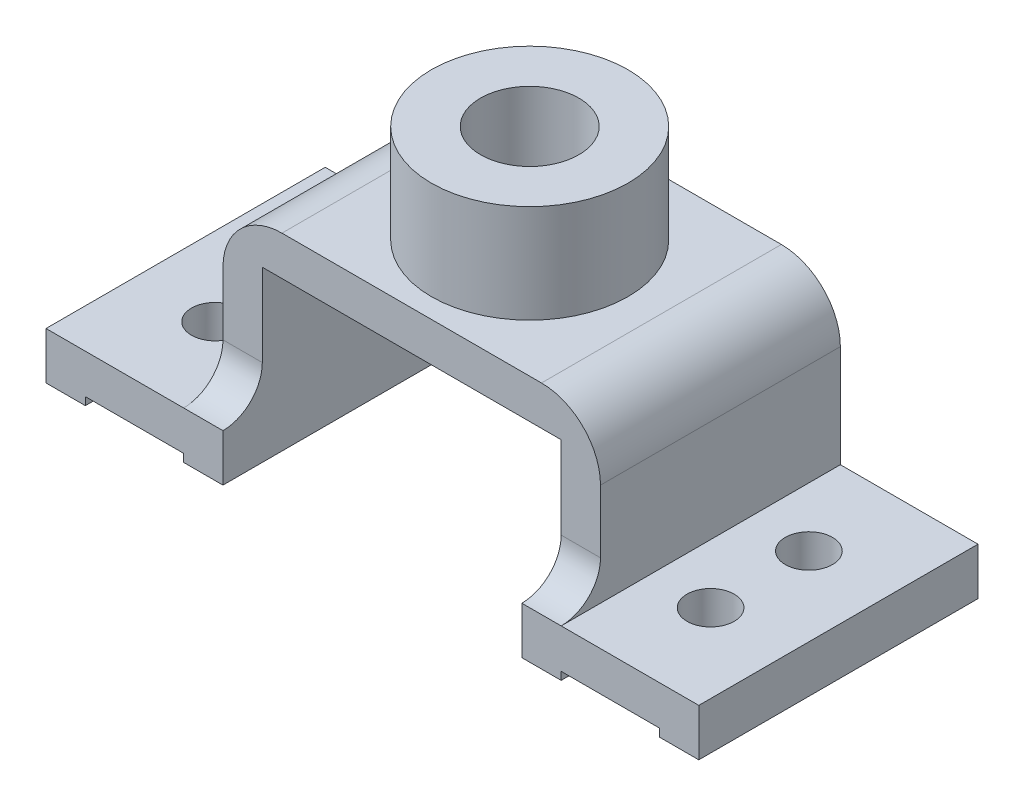
ISO-10303-21;
HEADER;
FILE_DESCRIPTION(('STEP AP214'),'2;1');
FILE_NAME('part.step','',(''),(''),'','','');
FILE_SCHEMA(('AUTOMOTIVE_DESIGN { 1 0 10303 214 1 1 1 1 }'));
ENDSEC;
DATA;
#1=APPLICATION_CONTEXT('core data for automotive mechanical design processes');
#2=APPLICATION_PROTOCOL_DEFINITION('international standard','automotive_design',2000,#1);
#3=PRODUCT_CONTEXT('',#1,'mechanical');
#4=PRODUCT('Part','Part','',(#3));
#5=PRODUCT_RELATED_PRODUCT_CATEGORY('part','',(#4));
#6=PRODUCT_DEFINITION_FORMATION('','',#4);
#7=PRODUCT_DEFINITION_CONTEXT('part definition',#1,'design');
#8=PRODUCT_DEFINITION('design','',#6,#7);
#9=PRODUCT_DEFINITION_SHAPE('','',#8);
#10=(LENGTH_UNIT() NAMED_UNIT(*) SI_UNIT(.MILLI.,.METRE.));
#11=(NAMED_UNIT(*) PLANE_ANGLE_UNIT() SI_UNIT($,.RADIAN.));
#12=(NAMED_UNIT(*) SI_UNIT($,.STERADIAN.) SOLID_ANGLE_UNIT());
#13=UNCERTAINTY_MEASURE_WITH_UNIT(LENGTH_MEASURE(1.E-05),#10,'distance_accuracy_value','');
#14=(GEOMETRIC_REPRESENTATION_CONTEXT(3) GLOBAL_UNCERTAINTY_ASSIGNED_CONTEXT((#13)) GLOBAL_UNIT_ASSIGNED_CONTEXT((#10,
#11,#12)) REPRESENTATION_CONTEXT('',''));
#15=CARTESIAN_POINT('',(0.,0.,0.));
#16=DIRECTION('',(0.,0.,1.));
#17=DIRECTION('',(1.,0.,0.));
#18=AXIS2_PLACEMENT_3D('',#15,#16,#17);
#19=CARTESIAN_POINT('',(-43.0476516234429,8.46441698999387,-71.));
#20=DIRECTION('',(-1.,0.,0.));
#21=DIRECTION('',(0.,0.,1.));
#22=AXIS2_PLACEMENT_3D('',#19,#20,#21);
#23=PLANE('',#22);
#24=DIRECTION('',(0.,-1.,0.));
#25=VECTOR('',#24,1.);
#26=CARTESIAN_POINT('',(-43.0476516234429,8.46441698999387,0.));
#27=LINE('',#26,#25);
#28=CARTESIAN_POINT('',(-43.0476516234429,8.46441698999387,0.));
#29=VERTEX_POINT('',#28);
#30=CARTESIAN_POINT('',(-43.0476516234429,-3.53558301000613,0.));
#31=VERTEX_POINT('',#30);
#32=EDGE_CURVE('E347',#29,#31,#27,.T.);
#33=ORIENTED_EDGE('',*,*,#32,.F.);
#34=DIRECTION('',(0.,0.,1.));
#35=VECTOR('',#34,1.);
#36=CARTESIAN_POINT('',(-43.0476516234429,8.46441698999387,-71.));
#37=LINE('',#36,#35);
#38=CARTESIAN_POINT('',(-43.0476516234429,8.46441698999387,-71.));
#39=VERTEX_POINT('',#38);
#40=EDGE_CURVE('E420',#39,#29,#37,.T.);
#41=ORIENTED_EDGE('',*,*,#40,.F.);
#42=DIRECTION('',(0.,-1.,0.));
#43=VECTOR('',#42,1.);
#44=CARTESIAN_POINT('',(-43.0476516234429,8.46441698999387,-71.));
#45=LINE('',#44,#43);
#46=CARTESIAN_POINT('',(-43.0476516234429,-3.53558301000613,-71.));
#47=VERTEX_POINT('',#46);
#48=EDGE_CURVE('E357',#39,#47,#45,.T.);
#49=ORIENTED_EDGE('',*,*,#48,.T.);
#50=DIRECTION('',(0.,0.,1.));
#51=VECTOR('',#50,1.);
#52=CARTESIAN_POINT('',(-43.0476516234429,-3.53558301000613,-71.));
#53=LINE('',#52,#51);
#54=EDGE_CURVE('E388',#47,#31,#53,.T.);
#55=ORIENTED_EDGE('',*,*,#54,.T.);
#56=EDGE_LOOP('',(#33,#41,#49,#55));
#57=FACE_BOUND('',#56,.T.);
#58=ADVANCED_FACE('F39',(#57),#23,.T.);
#59=CARTESIAN_POINT('',(1.95234837655708,8.46441698999388,-71.));
#60=DIRECTION('',(0.,1.,0.));
#61=DIRECTION('',(-1.,0.,0.));
#62=AXIS2_PLACEMENT_3D('',#59,#60,#61);
#63=PLANE('',#62);
#64=CARTESIAN_POINT('',(-23.0476516234429,8.46441698999388,-23.));
#65=DIRECTION('',(0.,1.,0.));
#66=DIRECTION('',(0.,0.,1.));
#67=AXIS2_PLACEMENT_3D('',#64,#65,#66);
#68=CIRCLE('',#67,5.99999999999999);
#69=CARTESIAN_POINT('',(-23.0476516234429,8.46441698999388,-17.));
#70=VERTEX_POINT('',#69);
#71=EDGE_CURVE('E900',#70,#70,#68,.T.);
#72=ORIENTED_EDGE('',*,*,#71,.F.);
#73=EDGE_LOOP('',(#72));
#74=FACE_BOUND('',#73,.T.);
#75=CARTESIAN_POINT('',(-23.0476516234429,8.46441698999388,-48.));
#76=DIRECTION('',(0.,1.,0.));
#77=DIRECTION('',(0.,0.,1.));
#78=AXIS2_PLACEMENT_3D('',#75,#76,#77);
#79=CIRCLE('',#78,5.99999999999999);
#80=CARTESIAN_POINT('',(-23.0476516234429,8.46441698999388,-42.));
#81=VERTEX_POINT('',#80);
#82=EDGE_CURVE('E844',#81,#81,#79,.T.);
#83=ORIENTED_EDGE('',*,*,#82,.F.);
#84=EDGE_LOOP('',(#83));
#85=FACE_BOUND('',#84,.T.);
#86=DIRECTION('',(-1.,0.,0.));
#87=VECTOR('',#86,1.);
#88=CARTESIAN_POINT('',(1.95234837655708,8.46441698999388,0.));
#89=LINE('',#88,#87);
#90=CARTESIAN_POINT('',(-8.04765162344291,8.46441698999388,0.));
#91=VERTEX_POINT('',#90);
#92=EDGE_CURVE('E416',#91,#29,#89,.T.);
#93=ORIENTED_EDGE('',*,*,#92,.F.);
#94=DIRECTION('',(0.,0.,1.));
#95=VECTOR('',#94,1.);
#96=CARTESIAN_POINT('',(-8.04765162344292,8.46441698999388,-71.));
#97=LINE('',#96,#95);
#98=CARTESIAN_POINT('',(-8.04765162344292,8.46441698999388,-71.));
#99=VERTEX_POINT('',#98);
#100=EDGE_CURVE('E344',#99,#91,#97,.T.);
#101=ORIENTED_EDGE('',*,*,#100,.F.);
#102=DIRECTION('',(-1.,0.,0.));
#103=VECTOR('',#102,1.);
#104=CARTESIAN_POINT('',(1.95234837655708,8.46441698999388,-71.));
#105=LINE('',#104,#103);
#106=EDGE_CURVE('E385',#99,#39,#105,.T.);
#107=ORIENTED_EDGE('',*,*,#106,.T.);
#108=ORIENTED_EDGE('',*,*,#40,.T.);
#109=EDGE_LOOP('',(#93,#101,#107,#108));
#110=FACE_BOUND('',#109,.T.);
#111=ADVANCED_FACE('F495',(#74,#85,#110),#63,.T.);
#112=CARTESIAN_POINT('',(1.95234837655708,-3.53558301000612,-71.));
#113=DIRECTION('',(1.,0.,0.));
#114=DIRECTION('',(0.,0.,-1.));
#115=AXIS2_PLACEMENT_3D('',#112,#113,#114);
#116=PLANE('',#115);
#117=DIRECTION('',(0.,1.,0.));
#118=VECTOR('',#117,1.);
#119=CARTESIAN_POINT('',(1.95234837655708,-3.53558301000612,0.));
#120=LINE('',#119,#118);
#121=CARTESIAN_POINT('',(1.95234837655708,-3.53558301000612,0.));
#122=VERTEX_POINT('',#121);
#123=CARTESIAN_POINT('',(1.95234837655708,8.46441698999388,0.));
#124=VERTEX_POINT('',#123);
#125=EDGE_CURVE('E412',#122,#124,#120,.T.);
#126=ORIENTED_EDGE('',*,*,#125,.F.);
#127=DIRECTION('',(0.,0.,1.));
#128=VECTOR('',#127,1.);
#129=CARTESIAN_POINT('',(1.95234837655708,-3.53558301000612,-71.));
#130=LINE('',#129,#128);
#131=CARTESIAN_POINT('',(1.95234837655708,-3.53558301000612,-71.));
#132=VERTEX_POINT('',#131);
#133=EDGE_CURVE('E425',#132,#122,#130,.T.);
#134=ORIENTED_EDGE('',*,*,#133,.F.);
#135=DIRECTION('',(0.,1.,0.));
#136=VECTOR('',#135,1.);
#137=CARTESIAN_POINT('',(1.95234837655708,-3.53558301000612,-71.));
#138=LINE('',#137,#136);
#139=CARTESIAN_POINT('',(1.95234837655708,39.4644169899939,-71.));
#140=VERTEX_POINT('',#139);
#141=EDGE_CURVE('E382',#132,#140,#138,.T.);
#142=ORIENTED_EDGE('',*,*,#141,.T.);
#143=DIRECTION('',(0.,0.,1.));
#144=VECTOR('',#143,1.);
#145=CARTESIAN_POINT('',(1.95234837655708,39.4644169899939,-71.));
#146=LINE('',#145,#144);
#147=CARTESIAN_POINT('',(1.95234837655708,39.4644169899939,-10.));
#148=VERTEX_POINT('',#147);
#149=EDGE_CURVE('E323',#140,#148,#146,.T.);
#150=ORIENTED_EDGE('',*,*,#149,.T.);
#151=DIRECTION('',(0.,1.,0.));
#152=VECTOR('',#151,1.);
#153=CARTESIAN_POINT('',(1.95234837655708,8.46441698999388,-10.));
#154=LINE('',#153,#152);
#155=CARTESIAN_POINT('',(1.95234837655708,18.4644169899939,-10.));
#156=VERTEX_POINT('',#155);
#157=EDGE_CURVE('E290',#156,#148,#154,.T.);
#158=ORIENTED_EDGE('',*,*,#157,.F.);
#159=CARTESIAN_POINT('',(1.95234837655708,18.4644169899939,0.));
#160=DIRECTION('',(1.,0.,0.));
#161=DIRECTION('',(0.,0.,-1.));
#162=AXIS2_PLACEMENT_3D('',#159,#160,#161);
#163=CIRCLE('',#162,10.);
#164=EDGE_CURVE('E456',#156,#124,#163,.F.);
#165=ORIENTED_EDGE('',*,*,#164,.T.);
#166=EDGE_LOOP('',(#126,#134,#142,#150,#158,#165));
#167=FACE_BOUND('',#166,.T.);
#168=ADVANCED_FACE('F522',(#167),#116,.T.);
#169=CARTESIAN_POINT('',(-8.04765162344292,-3.53558301000612,-71.));
#170=DIRECTION('',(0.,-1.,0.));
#171=DIRECTION('',(0.,0.,-1.));
#172=AXIS2_PLACEMENT_3D('',#169,#170,#171);
#173=PLANE('',#172);
#174=DIRECTION('',(1.,0.,0.));
#175=VECTOR('',#174,1.);
#176=CARTESIAN_POINT('',(-8.04765162344292,-3.53558301000612,0.));
#177=LINE('',#176,#175);
#178=CARTESIAN_POINT('',(-8.04765162344292,-3.53558301000612,0.));
#179=VERTEX_POINT('',#178);
#180=EDGE_CURVE('E408',#179,#122,#177,.T.);
#181=ORIENTED_EDGE('',*,*,#180,.F.);
#182=DIRECTION('',(0.,0.,1.));
#183=VECTOR('',#182,1.);
#184=CARTESIAN_POINT('',(-8.04765162344292,-3.53558301000612,-71.));
#185=LINE('',#184,#183);
#186=CARTESIAN_POINT('',(-8.04765162344292,-3.53558301000612,-71.));
#187=VERTEX_POINT('',#186);
#188=EDGE_CURVE('E428',#187,#179,#185,.T.);
#189=ORIENTED_EDGE('',*,*,#188,.F.);
#190=DIRECTION('',(1.,0.,0.));
#191=VECTOR('',#190,1.);
#192=CARTESIAN_POINT('',(-8.04765162344292,-3.53558301000612,-71.));
#193=LINE('',#192,#191);
#194=EDGE_CURVE('E378',#187,#132,#193,.T.);
#195=ORIENTED_EDGE('',*,*,#194,.T.);
#196=ORIENTED_EDGE('',*,*,#133,.T.);
#197=EDGE_LOOP('',(#181,#189,#195,#196));
#198=FACE_BOUND('',#197,.T.);
#199=ADVANCED_FACE('F518',(#198),#173,.T.);
#200=CARTESIAN_POINT('',(-8.04765162344292,-1.53558301000612,-71.));
#201=DIRECTION('',(-1.,0.,0.));
#202=DIRECTION('',(0.,-1.,0.));
#203=AXIS2_PLACEMENT_3D('',#200,#201,#202);
#204=PLANE('',#203);
#205=DIRECTION('',(0.,-1.,0.));
#206=VECTOR('',#205,1.);
#207=CARTESIAN_POINT('',(-8.04765162344292,-1.53558301000612,0.));
#208=LINE('',#207,#206);
#209=CARTESIAN_POINT('',(-8.04765162344292,-1.53558301000612,0.));
#210=VERTEX_POINT('',#209);
#211=EDGE_CURVE('E404',#210,#179,#208,.T.);
#212=ORIENTED_EDGE('',*,*,#211,.F.);
#213=DIRECTION('',(0.,0.,1.));
#214=VECTOR('',#213,1.);
#215=CARTESIAN_POINT('',(-8.04765162344292,-1.53558301000612,-71.));
#216=LINE('',#215,#214);
#217=CARTESIAN_POINT('',(-8.04765162344292,-1.53558301000612,-71.));
#218=VERTEX_POINT('',#217);
#219=EDGE_CURVE('E431',#218,#210,#216,.T.);
#220=ORIENTED_EDGE('',*,*,#219,.F.);
#221=DIRECTION('',(0.,-1.,0.));
#222=VECTOR('',#221,1.);
#223=CARTESIAN_POINT('',(-8.04765162344292,-1.53558301000612,-71.));
#224=LINE('',#223,#222);
#225=EDGE_CURVE('E374',#218,#187,#224,.T.);
#226=ORIENTED_EDGE('',*,*,#225,.T.);
#227=ORIENTED_EDGE('',*,*,#188,.T.);
#228=EDGE_LOOP('',(#212,#220,#226,#227));
#229=FACE_BOUND('',#228,.T.);
#230=ADVANCED_FACE('F514',(#229),#204,.T.);
#231=CARTESIAN_POINT('',(-33.0476516234429,-1.53558301000612,-71.));
#232=DIRECTION('',(0.,-1.,0.));
#233=DIRECTION('',(0.,0.,-1.));
#234=AXIS2_PLACEMENT_3D('',#231,#232,#233);
#235=PLANE('',#234);
#236=CARTESIAN_POINT('',(-23.0476516234429,-1.53558301000612,-23.));
#237=DIRECTION('',(0.,-1.,0.));
#238=DIRECTION('',(0.,0.,-1.));
#239=AXIS2_PLACEMENT_3D('',#236,#237,#238);
#240=CIRCLE('',#239,5.99999999999999);
#241=CARTESIAN_POINT('',(-23.0476516234429,-1.53558301000612,-29.));
#242=VERTEX_POINT('',#241);
#243=EDGE_CURVE('E837',#242,#242,#240,.T.);
#244=ORIENTED_EDGE('',*,*,#243,.F.);
#245=EDGE_LOOP('',(#244));
#246=FACE_BOUND('',#245,.T.);
#247=CARTESIAN_POINT('',(-23.0476516234429,-1.53558301000612,-48.));
#248=DIRECTION('',(0.,-1.,0.));
#249=DIRECTION('',(0.,0.,-1.));
#250=AXIS2_PLACEMENT_3D('',#247,#248,#249);
#251=CIRCLE('',#250,5.99999999999999);
#252=CARTESIAN_POINT('',(-23.0476516234429,-1.53558301000612,-54.));
#253=VERTEX_POINT('',#252);
#254=EDGE_CURVE('E840',#253,#253,#251,.T.);
#255=ORIENTED_EDGE('',*,*,#254,.F.);
#256=EDGE_LOOP('',(#255));
#257=FACE_BOUND('',#256,.T.);
#258=DIRECTION('',(1.,0.,0.));
#259=VECTOR('',#258,1.);
#260=CARTESIAN_POINT('',(-33.0476516234429,-1.53558301000612,0.));
#261=LINE('',#260,#259);
#262=CARTESIAN_POINT('',(-33.0476516234429,-1.53558301000612,0.));
#263=VERTEX_POINT('',#262);
#264=EDGE_CURVE('E400',#263,#210,#261,.T.);
#265=ORIENTED_EDGE('',*,*,#264,.F.);
#266=DIRECTION('',(0.,0.,1.));
#267=VECTOR('',#266,1.);
#268=CARTESIAN_POINT('',(-33.0476516234429,-1.53558301000612,-71.));
#269=LINE('',#268,#267);
#270=CARTESIAN_POINT('',(-33.0476516234429,-1.53558301000612,-71.));
#271=VERTEX_POINT('',#270);
#272=EDGE_CURVE('E434',#271,#263,#269,.T.);
#273=ORIENTED_EDGE('',*,*,#272,.F.);
#274=DIRECTION('',(1.,0.,0.));
#275=VECTOR('',#274,1.);
#276=CARTESIAN_POINT('',(-33.0476516234429,-1.53558301000612,-71.));
#277=LINE('',#276,#275);
#278=EDGE_CURVE('E370',#271,#218,#277,.T.);
#279=ORIENTED_EDGE('',*,*,#278,.T.);
#280=ORIENTED_EDGE('',*,*,#219,.T.);
#281=EDGE_LOOP('',(#265,#273,#279,#280));
#282=FACE_BOUND('',#281,.T.);
#283=ADVANCED_FACE('F510',(#246,#257,#282),#235,.T.);
#284=CARTESIAN_POINT('',(-33.0476516234429,-3.53558301000613,-71.));
#285=DIRECTION('',(1.,0.,0.));
#286=DIRECTION('',(0.,1.,0.));
#287=AXIS2_PLACEMENT_3D('',#284,#285,#286);
#288=PLANE('',#287);
#289=DIRECTION('',(0.,1.,0.));
#290=VECTOR('',#289,1.);
#291=CARTESIAN_POINT('',(-33.0476516234429,-3.53558301000613,0.));
#292=LINE('',#291,#290);
#293=CARTESIAN_POINT('',(-33.0476516234429,-3.53558301000613,0.));
#294=VERTEX_POINT('',#293);
#295=EDGE_CURVE('E396',#294,#263,#292,.T.);
#296=ORIENTED_EDGE('',*,*,#295,.F.);
#297=DIRECTION('',(0.,0.,1.));
#298=VECTOR('',#297,1.);
#299=CARTESIAN_POINT('',(-33.0476516234429,-3.53558301000613,-71.));
#300=LINE('',#299,#298);
#301=CARTESIAN_POINT('',(-33.0476516234429,-3.53558301000613,-71.));
#302=VERTEX_POINT('',#301);
#303=EDGE_CURVE('E437',#302,#294,#300,.T.);
#304=ORIENTED_EDGE('',*,*,#303,.F.);
#305=DIRECTION('',(0.,1.,0.));
#306=VECTOR('',#305,1.);
#307=CARTESIAN_POINT('',(-33.0476516234429,-3.53558301000613,-71.));
#308=LINE('',#307,#306);
#309=EDGE_CURVE('E366',#302,#271,#308,.T.);
#310=ORIENTED_EDGE('',*,*,#309,.T.);
#311=ORIENTED_EDGE('',*,*,#272,.T.);
#312=EDGE_LOOP('',(#296,#304,#310,#311));
#313=FACE_BOUND('',#312,.T.);
#314=ADVANCED_FACE('F506',(#313),#288,.T.);
#315=CARTESIAN_POINT('',(-43.0476516234429,-3.53558301000613,-71.));
#316=DIRECTION('',(0.,-1.,0.));
#317=DIRECTION('',(0.,0.,-1.));
#318=AXIS2_PLACEMENT_3D('',#315,#316,#317);
#319=PLANE('',#318);
#320=DIRECTION('',(1.,0.,0.));
#321=VECTOR('',#320,1.);
#322=CARTESIAN_POINT('',(-43.0476516234429,-3.53558301000613,0.));
#323=LINE('',#322,#321);
#324=EDGE_CURVE('E392',#31,#294,#323,.T.);
#325=ORIENTED_EDGE('',*,*,#324,.F.);
#326=ORIENTED_EDGE('',*,*,#54,.F.);
#327=DIRECTION('',(1.,0.,0.));
#328=VECTOR('',#327,1.);
#329=CARTESIAN_POINT('',(-43.0476516234429,-3.53558301000613,-71.));
#330=LINE('',#329,#328);
#331=EDGE_CURVE('E361',#47,#302,#330,.T.);
#332=ORIENTED_EDGE('',*,*,#331,.T.);
#333=ORIENTED_EDGE('',*,*,#303,.T.);
#334=EDGE_LOOP('',(#325,#326,#332,#333));
#335=FACE_BOUND('',#334,.T.);
#336=ADVANCED_FACE('F502',(#335),#319,.T.);
#337=CARTESIAN_POINT('',(0.,0.,-71.));
#338=DIRECTION('',(0.,0.,1.));
#339=DIRECTION('',(1.,0.,0.));
#340=AXIS2_PLACEMENT_3D('',#337,#338,#339);
#341=PLANE('',#340);
#342=DIRECTION('',(-1.,0.,0.));
#343=VECTOR('',#342,1.);
#344=CARTESIAN_POINT('',(87.9523483765571,49.4644169899939,-71.));
#345=LINE('',#344,#343);
#346=CARTESIAN_POINT('',(72.9523483765571,49.4644169899939,-71.));
#347=VERTEX_POINT('',#346);
#348=CARTESIAN_POINT('',(6.95234837655707,49.4644169899939,-71.));
#349=VERTEX_POINT('',#348);
#350=EDGE_CURVE('E317',#347,#349,#345,.T.);
#351=ORIENTED_EDGE('',*,*,#350,.F.);
#352=CARTESIAN_POINT('',(72.9523483765571,34.4644169899939,-71.));
#353=DIRECTION('',(0.,0.,1.));
#354=DIRECTION('',(1.,0.,0.));
#355=AXIS2_PLACEMENT_3D('',#352,#353,#354);
#356=CIRCLE('',#355,15.);
#357=CARTESIAN_POINT('',(87.9523483765571,34.4644169899939,-71.));
#358=VERTEX_POINT('',#357);
#359=EDGE_CURVE('E482',#347,#358,#356,.F.);
#360=ORIENTED_EDGE('',*,*,#359,.T.);
#361=DIRECTION('',(0.,1.,0.));
#362=VECTOR('',#361,1.);
#363=CARTESIAN_POINT('',(87.9523483765571,8.46441698999389,-71.));
#364=LINE('',#363,#362);
#365=CARTESIAN_POINT('',(87.9523483765571,8.46441698999388,-71.));
#366=VERTEX_POINT('',#365);
#367=EDGE_CURVE('E313',#366,#358,#364,.T.);
#368=ORIENTED_EDGE('',*,*,#367,.F.);
#369=DIRECTION('',(-1.,0.,0.));
#370=VECTOR('',#369,1.);
#371=CARTESIAN_POINT('',(77.9523483765571,8.46441698999387,-71.));
#372=LINE('',#371,#370);
#373=CARTESIAN_POINT('',(122.952348376557,8.46441698999389,-71.));
#374=VERTEX_POINT('',#373);
#375=EDGE_CURVE('E220',#374,#366,#372,.T.);
#376=ORIENTED_EDGE('',*,*,#375,.F.);
#377=DIRECTION('',(0.,1.,0.));
#378=VECTOR('',#377,1.);
#379=CARTESIAN_POINT('',(122.952348376557,8.46441698999389,-71.));
#380=LINE('',#379,#378);
#381=CARTESIAN_POINT('',(122.952348376557,-3.53558301000611,-71.));
#382=VERTEX_POINT('',#381);
#383=EDGE_CURVE('E256',#382,#374,#380,.T.);
#384=ORIENTED_EDGE('',*,*,#383,.F.);
#385=DIRECTION('',(1.,0.,0.));
#386=VECTOR('',#385,1.);
#387=CARTESIAN_POINT('',(122.952348376557,-3.53558301000611,-71.));
#388=LINE('',#387,#386);
#389=CARTESIAN_POINT('',(112.952348376557,-3.53558301000611,-71.));
#390=VERTEX_POINT('',#389);
#391=EDGE_CURVE('E252',#390,#382,#388,.T.);
#392=ORIENTED_EDGE('',*,*,#391,.F.);
#393=DIRECTION('',(0.,-1.,0.));
#394=VECTOR('',#393,1.);
#395=CARTESIAN_POINT('',(112.952348376557,-3.53558301000611,-71.));
#396=LINE('',#395,#394);
#397=CARTESIAN_POINT('',(112.952348376557,-1.53558301000613,-71.));
#398=VERTEX_POINT('',#397);
#399=EDGE_CURVE('E248',#398,#390,#396,.T.);
#400=ORIENTED_EDGE('',*,*,#399,.F.);
#401=DIRECTION('',(1.,0.,0.));
#402=VECTOR('',#401,1.);
#403=CARTESIAN_POINT('',(112.952348376557,-1.53558301000613,-71.));
#404=LINE('',#403,#402);
#405=CARTESIAN_POINT('',(87.9523483765571,-1.53558301000613,-71.));
#406=VERTEX_POINT('',#405);
#407=EDGE_CURVE('E229',#406,#398,#404,.T.);
#408=ORIENTED_EDGE('',*,*,#407,.F.);
#409=DIRECTION('',(0.,1.,0.));
#410=VECTOR('',#409,1.);
#411=CARTESIAN_POINT('',(87.9523483765571,-1.53558301000613,-71.));
#412=LINE('',#411,#410);
#413=CARTESIAN_POINT('',(87.9523483765571,-3.53558301000613,-71.));
#414=VERTEX_POINT('',#413);
#415=EDGE_CURVE('E211',#414,#406,#412,.T.);
#416=ORIENTED_EDGE('',*,*,#415,.F.);
#417=DIRECTION('',(1.,0.,0.));
#418=VECTOR('',#417,1.);
#419=CARTESIAN_POINT('',(87.9523483765571,-3.53558301000613,-71.));
#420=LINE('',#419,#418);
#421=CARTESIAN_POINT('',(77.9523483765571,-3.53558301000613,-71.));
#422=VERTEX_POINT('',#421);
#423=EDGE_CURVE('E226',#422,#414,#420,.T.);
#424=ORIENTED_EDGE('',*,*,#423,.F.);
#425=DIRECTION('',(0.,-1.,0.));
#426=VECTOR('',#425,1.);
#427=CARTESIAN_POINT('',(77.9523483765571,39.4644169899939,-71.));
#428=LINE('',#427,#426);
#429=CARTESIAN_POINT('',(77.9523483765571,39.4644169899939,-71.));
#430=VERTEX_POINT('',#429);
#431=EDGE_CURVE('E309',#430,#422,#428,.T.);
#432=ORIENTED_EDGE('',*,*,#431,.F.);
#433=DIRECTION('',(1.,0.,0.));
#434=VECTOR('',#433,1.);
#435=CARTESIAN_POINT('',(1.95234837655708,39.4644169899939,-71.));
#436=LINE('',#435,#434);
#437=EDGE_CURVE('E305',#140,#430,#436,.T.);
#438=ORIENTED_EDGE('',*,*,#437,.F.);
#439=ORIENTED_EDGE('',*,*,#141,.F.);
#440=ORIENTED_EDGE('',*,*,#194,.F.);
#441=ORIENTED_EDGE('',*,*,#225,.F.);
#442=ORIENTED_EDGE('',*,*,#278,.F.);
#443=ORIENTED_EDGE('',*,*,#309,.F.);
#444=ORIENTED_EDGE('',*,*,#331,.F.);
#445=ORIENTED_EDGE('',*,*,#48,.F.);
#446=ORIENTED_EDGE('',*,*,#106,.F.);
#447=DIRECTION('',(0.,-1.,0.));
#448=VECTOR('',#447,1.);
#449=CARTESIAN_POINT('',(-8.04765162344293,49.4644169899939,-71.));
#450=LINE('',#449,#448);
#451=CARTESIAN_POINT('',(-8.04765162344292,34.4644169899939,-71.));
#452=VERTEX_POINT('',#451);
#453=EDGE_CURVE('E320',#452,#99,#450,.T.);
#454=ORIENTED_EDGE('',*,*,#453,.F.);
#455=CARTESIAN_POINT('',(6.95234837655707,34.4644169899939,-71.));
#456=DIRECTION('',(0.,0.,1.));
#457=DIRECTION('',(1.,0.,0.));
#458=AXIS2_PLACEMENT_3D('',#455,#456,#457);
#459=CIRCLE('',#458,15.);
#460=EDGE_CURVE('E61',#452,#349,#459,.F.);
#461=ORIENTED_EDGE('',*,*,#460,.T.);
#462=EDGE_LOOP('',(#351,#360,#368,#376,#384,#392,#400,#408,#416,#424,#432,#438,#439,#440,#441,
#442,#443,#444,#445,#446,#454,#461));
#463=FACE_BOUND('',#462,.T.);
#464=ADVANCED_FACE('F224',(#463),#341,.F.);
#465=CARTESIAN_POINT('',(0.,0.,0.));
#466=DIRECTION('',(0.,0.,1.));
#467=DIRECTION('',(1.,0.,0.));
#468=AXIS2_PLACEMENT_3D('',#465,#466,#467);
#469=PLANE('',#468);
#470=ORIENTED_EDGE('',*,*,#32,.T.);
#471=ORIENTED_EDGE('',*,*,#324,.T.);
#472=ORIENTED_EDGE('',*,*,#295,.T.);
#473=ORIENTED_EDGE('',*,*,#264,.T.);
#474=ORIENTED_EDGE('',*,*,#211,.T.);
#475=ORIENTED_EDGE('',*,*,#180,.T.);
#476=ORIENTED_EDGE('',*,*,#125,.T.);
#477=EDGE_CURVE('E362',#124,#91,#89,.T.);
#478=ORIENTED_EDGE('',*,*,#477,.T.);
#479=ORIENTED_EDGE('',*,*,#92,.T.);
#480=EDGE_LOOP('',(#470,#471,#472,#473,#474,#475,#476,#478,#479));
#481=FACE_BOUND('',#480,.T.);
#482=ADVANCED_FACE('F488',(#481),#469,.T.);
#483=CARTESIAN_POINT('',(-8.04765162344293,49.4644169899939,-71.));
#484=DIRECTION('',(-1.,0.,0.));
#485=DIRECTION('',(0.,-1.,0.));
#486=AXIS2_PLACEMENT_3D('',#483,#484,#485);
#487=PLANE('',#486);
#488=DIRECTION('',(0.,-1.,0.));
#489=VECTOR('',#488,1.);
#490=CARTESIAN_POINT('',(-8.04765162344293,49.4644169899939,-10.));
#491=LINE('',#490,#489);
#492=CARTESIAN_POINT('',(-8.04765162344292,34.4644169899939,-10.));
#493=VERTEX_POINT('',#492);
#494=CARTESIAN_POINT('',(-8.04765162344292,18.4644169899939,-10.));
#495=VERTEX_POINT('',#494);
#496=EDGE_CURVE('E310',#493,#495,#491,.T.);
#497=ORIENTED_EDGE('',*,*,#496,.F.);
#498=DIRECTION('',(0.,0.,1.));
#499=VECTOR('',#498,1.);
#500=CARTESIAN_POINT('',(-8.04765162344292,34.4644169899939,-71.));
#501=LINE('',#500,#499);
#502=EDGE_CURVE('E48',#493,#452,#501,.F.);
#503=ORIENTED_EDGE('',*,*,#502,.T.);
#504=ORIENTED_EDGE('',*,*,#453,.T.);
#505=ORIENTED_EDGE('',*,*,#100,.T.);
#506=CARTESIAN_POINT('',(-8.04765162344292,18.4644169899939,0.));
#507=DIRECTION('',(-1.,0.,0.));
#508=DIRECTION('',(0.,-1.,0.));
#509=AXIS2_PLACEMENT_3D('',#506,#507,#508);
#510=CIRCLE('',#509,10.);
#511=EDGE_CURVE('E459',#91,#495,#510,.F.);
#512=ORIENTED_EDGE('',*,*,#511,.T.);
#513=EDGE_LOOP('',(#497,#503,#504,#505,#512));
#514=FACE_BOUND('',#513,.T.);
#515=ADVANCED_FACE('F529',(#514),#487,.T.);
#516=CARTESIAN_POINT('',(87.9523483765571,49.4644169899939,-71.));
#517=DIRECTION('',(0.,1.,0.));
#518=DIRECTION('',(-1.,0.,0.));
#519=AXIS2_PLACEMENT_3D('',#516,#517,#518);
#520=PLANE('',#519);
#521=CARTESIAN_POINT('',(39.9523483765571,49.4644169899939,-40.));
#522=DIRECTION('',(0.,1.,0.));
#523=DIRECTION('',(-1.,0.,0.));
#524=AXIS2_PLACEMENT_3D('',#521,#522,#523);
#525=CIRCLE('',#524,25.);
#526=CARTESIAN_POINT('',(14.9523483765571,49.4644169899939,-40.));
#527=VERTEX_POINT('',#526);
#528=EDGE_CURVE('E243',#527,#527,#525,.T.);
#529=ORIENTED_EDGE('',*,*,#528,.F.);
#530=EDGE_LOOP('',(#529));
#531=FACE_BOUND('',#530,.T.);
#532=DIRECTION('',(-1.,0.,0.));
#533=VECTOR('',#532,1.);
#534=CARTESIAN_POINT('',(87.9523483765571,49.4644169899939,-10.));
#535=LINE('',#534,#533);
#536=CARTESIAN_POINT('',(72.9523483765571,49.4644169899939,-10.));
#537=VERTEX_POINT('',#536);
#538=CARTESIAN_POINT('',(6.95234837655707,49.4644169899939,-10.));
#539=VERTEX_POINT('',#538);
#540=EDGE_CURVE('E338',#537,#539,#535,.T.);
#541=ORIENTED_EDGE('',*,*,#540,.F.);
#542=DIRECTION('',(0.,0.,1.));
#543=VECTOR('',#542,1.);
#544=CARTESIAN_POINT('',(72.9523483765571,49.4644169899939,-71.));
#545=LINE('',#544,#543);
#546=EDGE_CURVE('E477',#537,#347,#545,.F.);
#547=ORIENTED_EDGE('',*,*,#546,.T.);
#548=ORIENTED_EDGE('',*,*,#350,.T.);
#549=DIRECTION('',(0.,0.,1.));
#550=VECTOR('',#549,1.);
#551=CARTESIAN_POINT('',(6.95234837655707,49.4644169899939,-71.));
#552=LINE('',#551,#550);
#553=EDGE_CURVE('E473',#349,#539,#552,.T.);
#554=ORIENTED_EDGE('',*,*,#553,.T.);
#555=EDGE_LOOP('',(#541,#547,#548,#554));
#556=FACE_BOUND('',#555,.T.);
#557=ADVANCED_FACE('F576',(#531,#556),#520,.T.);
#558=CARTESIAN_POINT('',(87.9523483765571,8.46441698999389,-71.));
#559=DIRECTION('',(1.,0.,0.));
#560=DIRECTION('',(0.,0.,-1.));
#561=AXIS2_PLACEMENT_3D('',#558,#559,#560);
#562=PLANE('',#561);
#563=ORIENTED_EDGE('',*,*,#367,.T.);
#564=DIRECTION('',(0.,0.,1.));
#565=VECTOR('',#564,1.);
#566=CARTESIAN_POINT('',(87.9523483765571,34.4644169899939,-71.));
#567=LINE('',#566,#565);
#568=CARTESIAN_POINT('',(87.9523483765571,34.4644169899939,-10.));
#569=VERTEX_POINT('',#568);
#570=EDGE_CURVE('E463',#358,#569,#567,.T.);
#571=ORIENTED_EDGE('',*,*,#570,.T.);
#572=DIRECTION('',(0.,1.,0.));
#573=VECTOR('',#572,1.);
#574=CARTESIAN_POINT('',(87.9523483765571,8.46441698999389,-10.));
#575=LINE('',#574,#573);
#576=CARTESIAN_POINT('',(87.9523483765571,18.4644169899939,-10.));
#577=VERTEX_POINT('',#576);
#578=EDGE_CURVE('E334',#577,#569,#575,.T.);
#579=ORIENTED_EDGE('',*,*,#578,.F.);
#580=CARTESIAN_POINT('',(87.9523483765571,18.4644169899939,0.));
#581=DIRECTION('',(1.,0.,0.));
#582=DIRECTION('',(0.,0.,-1.));
#583=AXIS2_PLACEMENT_3D('',#580,#581,#582);
#584=CIRCLE('',#583,10.);
#585=CARTESIAN_POINT('',(87.9523483765571,8.46441698999388,0.));
#586=VERTEX_POINT('',#585);
#587=EDGE_CURVE('E449',#577,#586,#584,.F.);
#588=ORIENTED_EDGE('',*,*,#587,.T.);
#589=DIRECTION('',(0.,0.,1.));
#590=VECTOR('',#589,1.);
#591=CARTESIAN_POINT('',(87.9523483765571,8.46441698999389,-71.));
#592=LINE('',#591,#590);
#593=EDGE_CURVE('E348',#366,#586,#592,.T.);
#594=ORIENTED_EDGE('',*,*,#593,.F.);
#595=EDGE_LOOP('',(#563,#571,#579,#588,#594));
#596=FACE_BOUND('',#595,.T.);
#597=ADVANCED_FACE('F545',(#596),#562,.T.);
#598=CARTESIAN_POINT('',(77.9523483765571,39.4644169899939,-71.));
#599=DIRECTION('',(-1.,0.,0.));
#600=DIRECTION('',(0.,0.,1.));
#601=AXIS2_PLACEMENT_3D('',#598,#599,#600);
#602=PLANE('',#601);
#603=DIRECTION('',(0.,-1.,0.));
#604=VECTOR('',#603,1.);
#605=CARTESIAN_POINT('',(77.9523483765571,39.4644169899939,-10.));
#606=LINE('',#605,#604);
#607=CARTESIAN_POINT('',(77.9523483765571,39.4644169899939,-10.));
#608=VERTEX_POINT('',#607);
#609=CARTESIAN_POINT('',(77.9523483765571,18.4644169899939,-10.));
#610=VERTEX_POINT('',#609);
#611=EDGE_CURVE('E330',#608,#610,#606,.T.);
#612=ORIENTED_EDGE('',*,*,#611,.F.);
#613=DIRECTION('',(0.,0.,1.));
#614=VECTOR('',#613,1.);
#615=CARTESIAN_POINT('',(77.9523483765571,39.4644169899939,-71.));
#616=LINE('',#615,#614);
#617=EDGE_CURVE('E351',#430,#608,#616,.T.);
#618=ORIENTED_EDGE('',*,*,#617,.F.);
#619=ORIENTED_EDGE('',*,*,#431,.T.);
#620=DIRECTION('',(0.,0.,1.));
#621=VECTOR('',#620,1.);
#622=CARTESIAN_POINT('',(77.9523483765571,-3.53558301000613,-71.));
#623=LINE('',#622,#621);
#624=CARTESIAN_POINT('',(77.9523483765571,-3.53558301000613,0.));
#625=VERTEX_POINT('',#624);
#626=EDGE_CURVE('E234',#422,#625,#623,.T.);
#627=ORIENTED_EDGE('',*,*,#626,.T.);
#628=DIRECTION('',(0.,-1.,0.));
#629=VECTOR('',#628,1.);
#630=CARTESIAN_POINT('',(77.9523483765571,-3.53558301000613,0.));
#631=LINE('',#630,#629);
#632=CARTESIAN_POINT('',(77.9523483765571,8.46441698999387,0.));
#633=VERTEX_POINT('',#632);
#634=EDGE_CURVE('E236',#633,#625,#631,.T.);
#635=ORIENTED_EDGE('',*,*,#634,.F.);
#636=CARTESIAN_POINT('',(77.9523483765571,18.4644169899939,0.));
#637=DIRECTION('',(-1.,0.,0.));
#638=DIRECTION('',(0.,0.,1.));
#639=AXIS2_PLACEMENT_3D('',#636,#637,#638);
#640=CIRCLE('',#639,10.);
#641=EDGE_CURVE('E453',#633,#610,#640,.F.);
#642=ORIENTED_EDGE('',*,*,#641,.T.);
#643=EDGE_LOOP('',(#612,#618,#619,#627,#635,#642));
#644=FACE_BOUND('',#643,.T.);
#645=ADVANCED_FACE('F568',(#644),#602,.T.);
#646=CARTESIAN_POINT('',(1.95234837655708,39.4644169899939,-71.));
#647=DIRECTION('',(0.,-1.,0.));
#648=DIRECTION('',(0.,0.,-1.));
#649=AXIS2_PLACEMENT_3D('',#646,#647,#648);
#650=PLANE('',#649);
#651=DIRECTION('',(1.,0.,0.));
#652=VECTOR('',#651,1.);
#653=CARTESIAN_POINT('',(1.95234837655708,39.4644169899939,-10.));
#654=LINE('',#653,#652);
#655=EDGE_CURVE('E326',#148,#608,#654,.T.);
#656=ORIENTED_EDGE('',*,*,#655,.F.);
#657=ORIENTED_EDGE('',*,*,#149,.F.);
#658=ORIENTED_EDGE('',*,*,#437,.T.);
#659=ORIENTED_EDGE('',*,*,#617,.T.);
#660=EDGE_LOOP('',(#656,#657,#658,#659));
#661=FACE_BOUND('',#660,.T.);
#662=ADVANCED_FACE('F534',(#661),#650,.T.);
#663=CARTESIAN_POINT('',(0.,0.,-10.));
#664=DIRECTION('',(0.,0.,1.));
#665=DIRECTION('',(1.,0.,0.));
#666=AXIS2_PLACEMENT_3D('',#663,#664,#665);
#667=PLANE('',#666);
#668=ORIENTED_EDGE('',*,*,#578,.T.);
#669=CARTESIAN_POINT('',(72.9523483765571,34.4644169899939,-10.));
#670=DIRECTION('',(0.,0.,1.));
#671=DIRECTION('',(1.,0.,0.));
#672=AXIS2_PLACEMENT_3D('',#669,#670,#671);
#673=CIRCLE('',#672,15.);
#674=EDGE_CURVE('E470',#569,#537,#673,.T.);
#675=ORIENTED_EDGE('',*,*,#674,.T.);
#676=ORIENTED_EDGE('',*,*,#540,.T.);
#677=CARTESIAN_POINT('',(6.95234837655707,34.4644169899939,-10.));
#678=DIRECTION('',(0.,0.,1.));
#679=DIRECTION('',(1.,0.,0.));
#680=AXIS2_PLACEMENT_3D('',#677,#678,#679);
#681=CIRCLE('',#680,15.);
#682=EDGE_CURVE('E467',#539,#493,#681,.T.);
#683=ORIENTED_EDGE('',*,*,#682,.T.);
#684=ORIENTED_EDGE('',*,*,#496,.T.);
#685=DIRECTION('',(1.,0.,0.));
#686=VECTOR('',#685,1.);
#687=CARTESIAN_POINT('',(1.95234837655708,18.4644169899939,-10.));
#688=LINE('',#687,#686);
#689=EDGE_CURVE('E424',#495,#156,#688,.T.);
#690=ORIENTED_EDGE('',*,*,#689,.T.);
#691=ORIENTED_EDGE('',*,*,#157,.T.);
#692=ORIENTED_EDGE('',*,*,#655,.T.);
#693=ORIENTED_EDGE('',*,*,#611,.T.);
#694=DIRECTION('',(1.,0.,0.));
#695=VECTOR('',#694,1.);
#696=CARTESIAN_POINT('',(87.9523483765571,18.4644169899939,-10.));
#697=LINE('',#696,#695);
#698=EDGE_CURVE('E445',#610,#577,#697,.T.);
#699=ORIENTED_EDGE('',*,*,#698,.T.);
#700=EDGE_LOOP('',(#668,#675,#676,#683,#684,#690,#691,#692,#693,#699));
#701=FACE_BOUND('',#700,.T.);
#702=ADVANCED_FACE('F528',(#701),#667,.T.);
#703=CARTESIAN_POINT('',(87.9523483765571,-3.53558301000613,-71.));
#704=DIRECTION('',(0.,-1.,0.));
#705=DIRECTION('',(1.,0.,0.));
#706=AXIS2_PLACEMENT_3D('',#703,#704,#705);
#707=PLANE('',#706);
#708=DIRECTION('',(1.,0.,0.));
#709=VECTOR('',#708,1.);
#710=CARTESIAN_POINT('',(87.9523483765571,-3.53558301000613,0.));
#711=LINE('',#710,#709);
#712=CARTESIAN_POINT('',(87.9523483765571,-3.53558301000613,0.));
#713=VERTEX_POINT('',#712);
#714=EDGE_CURVE('E262',#625,#713,#711,.T.);
#715=ORIENTED_EDGE('',*,*,#714,.F.);
#716=ORIENTED_EDGE('',*,*,#626,.F.);
#717=ORIENTED_EDGE('',*,*,#423,.T.);
#718=DIRECTION('',(0.,0.,1.));
#719=VECTOR('',#718,1.);
#720=CARTESIAN_POINT('',(87.9523483765571,-3.53558301000613,-71.));
#721=LINE('',#720,#719);
#722=EDGE_CURVE('E208',#414,#713,#721,.T.);
#723=ORIENTED_EDGE('',*,*,#722,.T.);
#724=EDGE_LOOP('',(#715,#716,#717,#723));
#725=FACE_BOUND('',#724,.T.);
#726=ADVANCED_FACE('F233',(#725),#707,.T.);
#727=CARTESIAN_POINT('',(77.9523483765571,8.46441698999387,-71.));
#728=DIRECTION('',(0.,1.,0.));
#729=DIRECTION('',(-1.,0.,0.));
#730=AXIS2_PLACEMENT_3D('',#727,#728,#729);
#731=PLANE('',#730);
#732=CARTESIAN_POINT('',(102.952348376557,8.46441698999388,-48.));
#733=DIRECTION('',(0.,1.,0.));
#734=DIRECTION('',(0.,0.,1.));
#735=AXIS2_PLACEMENT_3D('',#732,#733,#734);
#736=CIRCLE('',#735,6.00000000000001);
#737=CARTESIAN_POINT('',(102.952348376557,8.46441698999388,-42.));
#738=VERTEX_POINT('',#737);
#739=EDGE_CURVE('E843',#738,#738,#736,.T.);
#740=ORIENTED_EDGE('',*,*,#739,.F.);
#741=EDGE_LOOP('',(#740));
#742=FACE_BOUND('',#741,.T.);
#743=CARTESIAN_POINT('',(102.952348376557,8.46441698999388,-23.));
#744=DIRECTION('',(0.,1.,0.));
#745=DIRECTION('',(0.,0.,1.));
#746=AXIS2_PLACEMENT_3D('',#743,#744,#745);
#747=CIRCLE('',#746,6.00000000000001);
#748=CARTESIAN_POINT('',(102.952348376557,8.46441698999388,-17.));
#749=VERTEX_POINT('',#748);
#750=EDGE_CURVE('E858',#749,#749,#747,.T.);
#751=ORIENTED_EDGE('',*,*,#750,.F.);
#752=EDGE_LOOP('',(#751));
#753=FACE_BOUND('',#752,.T.);
#754=ORIENTED_EDGE('',*,*,#593,.T.);
#755=DIRECTION('',(-1.,0.,0.));
#756=VECTOR('',#755,1.);
#757=CARTESIAN_POINT('',(77.9523483765571,8.46441698999387,0.));
#758=LINE('',#757,#756);
#759=CARTESIAN_POINT('',(122.952348376557,8.46441698999389,0.));
#760=VERTEX_POINT('',#759);
#761=EDGE_CURVE('E240',#760,#586,#758,.T.);
#762=ORIENTED_EDGE('',*,*,#761,.F.);
#763=DIRECTION('',(0.,0.,1.));
#764=VECTOR('',#763,1.);
#765=CARTESIAN_POINT('',(122.952348376557,8.46441698999389,-71.));
#766=LINE('',#765,#764);
#767=EDGE_CURVE('E291',#374,#760,#766,.T.);
#768=ORIENTED_EDGE('',*,*,#767,.F.);
#769=ORIENTED_EDGE('',*,*,#375,.T.);
#770=EDGE_LOOP('',(#754,#762,#768,#769));
#771=FACE_BOUND('',#770,.T.);
#772=ADVANCED_FACE('F553',(#742,#753,#771),#731,.T.);
#773=CARTESIAN_POINT('',(122.952348376557,8.46441698999389,-71.));
#774=DIRECTION('',(1.,0.,0.));
#775=DIRECTION('',(0.,1.,0.));
#776=AXIS2_PLACEMENT_3D('',#773,#774,#775);
#777=PLANE('',#776);
#778=DIRECTION('',(0.,1.,0.));
#779=VECTOR('',#778,1.);
#780=CARTESIAN_POINT('',(122.952348376557,8.46441698999389,0.));
#781=LINE('',#780,#779);
#782=CARTESIAN_POINT('',(122.952348376557,-3.53558301000611,0.));
#783=VERTEX_POINT('',#782);
#784=EDGE_CURVE('E280',#783,#760,#781,.T.);
#785=ORIENTED_EDGE('',*,*,#784,.F.);
#786=DIRECTION('',(0.,0.,1.));
#787=VECTOR('',#786,1.);
#788=CARTESIAN_POINT('',(122.952348376557,-3.53558301000611,-71.));
#789=LINE('',#788,#787);
#790=EDGE_CURVE('E294',#382,#783,#789,.T.);
#791=ORIENTED_EDGE('',*,*,#790,.F.);
#792=ORIENTED_EDGE('',*,*,#383,.T.);
#793=ORIENTED_EDGE('',*,*,#767,.T.);
#794=EDGE_LOOP('',(#785,#791,#792,#793));
#795=FACE_BOUND('',#794,.T.);
#796=ADVANCED_FACE('F558',(#795),#777,.T.);
#797=CARTESIAN_POINT('',(122.952348376557,-3.53558301000611,-71.));
#798=DIRECTION('',(0.,-1.,0.));
#799=DIRECTION('',(1.,0.,0.));
#800=AXIS2_PLACEMENT_3D('',#797,#798,#799);
#801=PLANE('',#800);
#802=DIRECTION('',(1.,0.,0.));
#803=VECTOR('',#802,1.);
#804=CARTESIAN_POINT('',(122.952348376557,-3.53558301000611,0.));
#805=LINE('',#804,#803);
#806=CARTESIAN_POINT('',(112.952348376557,-3.53558301000611,0.));
#807=VERTEX_POINT('',#806);
#808=EDGE_CURVE('E276',#807,#783,#805,.T.);
#809=ORIENTED_EDGE('',*,*,#808,.F.);
#810=DIRECTION('',(0.,0.,1.));
#811=VECTOR('',#810,1.);
#812=CARTESIAN_POINT('',(112.952348376557,-3.53558301000611,-71.));
#813=LINE('',#812,#811);
#814=EDGE_CURVE('E297',#390,#807,#813,.T.);
#815=ORIENTED_EDGE('',*,*,#814,.F.);
#816=ORIENTED_EDGE('',*,*,#391,.T.);
#817=ORIENTED_EDGE('',*,*,#790,.T.);
#818=EDGE_LOOP('',(#809,#815,#816,#817));
#819=FACE_BOUND('',#818,.T.);
#820=ADVANCED_FACE('F561',(#819),#801,.T.);
#821=CARTESIAN_POINT('',(112.952348376557,-3.53558301000611,-71.));
#822=DIRECTION('',(-1.,0.,0.));
#823=DIRECTION('',(0.,0.,1.));
#824=AXIS2_PLACEMENT_3D('',#821,#822,#823);
#825=PLANE('',#824);
#826=DIRECTION('',(0.,-1.,0.));
#827=VECTOR('',#826,1.);
#828=CARTESIAN_POINT('',(112.952348376557,-3.53558301000611,0.));
#829=LINE('',#828,#827);
#830=CARTESIAN_POINT('',(112.952348376557,-1.53558301000613,0.));
#831=VERTEX_POINT('',#830);
#832=EDGE_CURVE('E272',#831,#807,#829,.T.);
#833=ORIENTED_EDGE('',*,*,#832,.F.);
#834=DIRECTION('',(0.,0.,1.));
#835=VECTOR('',#834,1.);
#836=CARTESIAN_POINT('',(112.952348376557,-1.53558301000613,-71.));
#837=LINE('',#836,#835);
#838=EDGE_CURVE('E300',#398,#831,#837,.T.);
#839=ORIENTED_EDGE('',*,*,#838,.F.);
#840=ORIENTED_EDGE('',*,*,#399,.T.);
#841=ORIENTED_EDGE('',*,*,#814,.T.);
#842=EDGE_LOOP('',(#833,#839,#840,#841));
#843=FACE_BOUND('',#842,.T.);
#844=ADVANCED_FACE('F564',(#843),#825,.T.);
#845=CARTESIAN_POINT('',(112.952348376557,-1.53558301000613,-71.));
#846=DIRECTION('',(0.,-1.,0.));
#847=DIRECTION('',(1.,0.,0.));
#848=AXIS2_PLACEMENT_3D('',#845,#846,#847);
#849=PLANE('',#848);
#850=CARTESIAN_POINT('',(102.952348376557,-1.53558301000613,-48.));
#851=DIRECTION('',(0.,-1.,0.));
#852=DIRECTION('',(1.,0.,0.));
#853=AXIS2_PLACEMENT_3D('',#850,#851,#852);
#854=CIRCLE('',#853,6.);
#855=CARTESIAN_POINT('',(108.952348376557,-1.53558301000613,-48.));
#856=VERTEX_POINT('',#855);
#857=EDGE_CURVE('E849',#856,#856,#854,.T.);
#858=ORIENTED_EDGE('',*,*,#857,.F.);
#859=EDGE_LOOP('',(#858));
#860=FACE_BOUND('',#859,.T.);
#861=CARTESIAN_POINT('',(102.952348376557,-1.53558301000613,-23.));
#862=DIRECTION('',(0.,-1.,0.));
#863=DIRECTION('',(1.,0.,0.));
#864=AXIS2_PLACEMENT_3D('',#861,#862,#863);
#865=CIRCLE('',#864,6.);
#866=CARTESIAN_POINT('',(108.952348376557,-1.53558301000613,-23.));
#867=VERTEX_POINT('',#866);
#868=EDGE_CURVE('E862',#867,#867,#865,.T.);
#869=ORIENTED_EDGE('',*,*,#868,.F.);
#870=EDGE_LOOP('',(#869));
#871=FACE_BOUND('',#870,.T.);
#872=DIRECTION('',(1.,0.,0.));
#873=VECTOR('',#872,1.);
#874=CARTESIAN_POINT('',(112.952348376557,-1.53558301000613,0.));
#875=LINE('',#874,#873);
#876=CARTESIAN_POINT('',(87.9523483765571,-1.53558301000613,0.));
#877=VERTEX_POINT('',#876);
#878=EDGE_CURVE('E268',#877,#831,#875,.T.);
#879=ORIENTED_EDGE('',*,*,#878,.F.);
#880=DIRECTION('',(0.,0.,1.));
#881=VECTOR('',#880,1.);
#882=CARTESIAN_POINT('',(87.9523483765571,-1.53558301000613,-71.));
#883=LINE('',#882,#881);
#884=EDGE_CURVE('E219',#406,#877,#883,.T.);
#885=ORIENTED_EDGE('',*,*,#884,.F.);
#886=ORIENTED_EDGE('',*,*,#407,.T.);
#887=ORIENTED_EDGE('',*,*,#838,.T.);
#888=EDGE_LOOP('',(#879,#885,#886,#887));
#889=FACE_BOUND('',#888,.T.);
#890=ADVANCED_FACE('F567',(#860,#871,#889),#849,.T.);
#891=CARTESIAN_POINT('',(87.9523483765571,-1.53558301000613,-71.));
#892=DIRECTION('',(1.,0.,0.));
#893=DIRECTION('',(0.,0.,-1.));
#894=AXIS2_PLACEMENT_3D('',#891,#892,#893);
#895=PLANE('',#894);
#896=DIRECTION('',(0.,1.,0.));
#897=VECTOR('',#896,1.);
#898=CARTESIAN_POINT('',(87.9523483765571,-1.53558301000613,0.));
#899=LINE('',#898,#897);
#900=EDGE_CURVE('E213',#713,#877,#899,.T.);
#901=ORIENTED_EDGE('',*,*,#900,.F.);
#902=ORIENTED_EDGE('',*,*,#722,.F.);
#903=ORIENTED_EDGE('',*,*,#415,.T.);
#904=ORIENTED_EDGE('',*,*,#884,.T.);
#905=EDGE_LOOP('',(#901,#902,#903,#904));
#906=FACE_BOUND('',#905,.T.);
#907=ADVANCED_FACE('F210',(#906),#895,.T.);
#908=CARTESIAN_POINT('',(0.,0.,0.));
#909=DIRECTION('',(0.,0.,-1.));
#910=DIRECTION('',(-1.,0.,0.));
#911=AXIS2_PLACEMENT_3D('',#908,#909,#910);
#912=PLANE('',#911);
#913=ORIENTED_EDGE('',*,*,#714,.T.);
#914=ORIENTED_EDGE('',*,*,#900,.T.);
#915=ORIENTED_EDGE('',*,*,#878,.T.);
#916=ORIENTED_EDGE('',*,*,#832,.T.);
#917=ORIENTED_EDGE('',*,*,#808,.T.);
#918=ORIENTED_EDGE('',*,*,#784,.T.);
#919=ORIENTED_EDGE('',*,*,#761,.T.);
#920=EDGE_CURVE('E284',#586,#633,#758,.T.);
#921=ORIENTED_EDGE('',*,*,#920,.T.);
#922=ORIENTED_EDGE('',*,*,#634,.T.);
#923=EDGE_LOOP('',(#913,#914,#915,#916,#917,#918,#919,#921,#922));
#924=FACE_BOUND('',#923,.T.);
#925=ADVANCED_FACE('F549',(#924),#912,.F.);
#926=CARTESIAN_POINT('',(0.,18.4644169899938,0.));
#927=DIRECTION('',(-1.,0.,0.));
#928=DIRECTION('',(0.,-1.,0.));
#929=AXIS2_PLACEMENT_3D('',#926,#927,#928);
#930=CYLINDRICAL_SURFACE('',#929,10.);
#931=ORIENTED_EDGE('',*,*,#641,.F.);
#932=ORIENTED_EDGE('',*,*,#920,.F.);
#933=ORIENTED_EDGE('',*,*,#587,.F.);
#934=ORIENTED_EDGE('',*,*,#698,.F.);
#935=EDGE_LOOP('',(#931,#932,#933,#934));
#936=FACE_BOUND('',#935,.T.);
#937=ADVANCED_FACE('F541',(#936),#930,.F.);
#938=CARTESIAN_POINT('',(0.,18.4644169899939,0.));
#939=DIRECTION('',(-1.,0.,0.));
#940=DIRECTION('',(0.,-1.,0.));
#941=AXIS2_PLACEMENT_3D('',#938,#939,#940);
#942=CYLINDRICAL_SURFACE('',#941,10.);
#943=ORIENTED_EDGE('',*,*,#511,.F.);
#944=ORIENTED_EDGE('',*,*,#477,.F.);
#945=ORIENTED_EDGE('',*,*,#164,.F.);
#946=ORIENTED_EDGE('',*,*,#689,.F.);
#947=EDGE_LOOP('',(#943,#944,#945,#946));
#948=FACE_BOUND('',#947,.T.);
#949=ADVANCED_FACE('F526',(#948),#942,.F.);
#950=CARTESIAN_POINT('',(72.9523483765571,34.4644169899939,-71.));
#951=DIRECTION('',(0.,0.,1.));
#952=DIRECTION('',(1.,0.,0.));
#953=AXIS2_PLACEMENT_3D('',#950,#951,#952);
#954=CYLINDRICAL_SURFACE('',#953,15.);
#955=ORIENTED_EDGE('',*,*,#359,.F.);
#956=ORIENTED_EDGE('',*,*,#546,.F.);
#957=ORIENTED_EDGE('',*,*,#674,.F.);
#958=ORIENTED_EDGE('',*,*,#570,.F.);
#959=EDGE_LOOP('',(#955,#956,#957,#958));
#960=FACE_BOUND('',#959,.T.);
#961=ADVANCED_FACE('F591',(#960),#954,.T.);
#962=CARTESIAN_POINT('',(6.95234837655707,34.4644169899939,-71.));
#963=DIRECTION('',(0.,0.,1.));
#964=DIRECTION('',(1.,0.,0.));
#965=AXIS2_PLACEMENT_3D('',#962,#963,#964);
#966=CYLINDRICAL_SURFACE('',#965,15.);
#967=ORIENTED_EDGE('',*,*,#460,.F.);
#968=ORIENTED_EDGE('',*,*,#502,.F.);
#969=ORIENTED_EDGE('',*,*,#682,.F.);
#970=ORIENTED_EDGE('',*,*,#553,.F.);
#971=EDGE_LOOP('',(#967,#968,#969,#970));
#972=FACE_BOUND('',#971,.T.);
#973=ADVANCED_FACE('F41',(#972),#966,.T.);
#974=CARTESIAN_POINT('',(39.9523483765571,74.4644169899939,-40.));
#975=DIRECTION('',(0.,1.,0.));
#976=DIRECTION('',(-1.,0.,0.));
#977=AXIS2_PLACEMENT_3D('',#974,#975,#976);
#978=PLANE('',#977);
#979=CARTESIAN_POINT('',(39.9523483765571,74.4644169899939,-40.));
#980=DIRECTION('',(0.,1.,0.));
#981=DIRECTION('',(-1.,0.,0.));
#982=AXIS2_PLACEMENT_3D('',#979,#980,#981);
#983=CIRCLE('',#982,25.);
#984=CARTESIAN_POINT('',(14.9523483765571,74.4644169899939,-40.));
#985=VERTEX_POINT('',#984);
#986=EDGE_CURVE('E265',#985,#985,#983,.T.);
#987=ORIENTED_EDGE('',*,*,#986,.T.);
#988=EDGE_LOOP('',(#987));
#989=FACE_BOUND('',#988,.T.);
#990=CARTESIAN_POINT('',(39.9523483765571,74.4644169899939,-40.));
#991=DIRECTION('',(0.,1.,0.));
#992=DIRECTION('',(-1.,0.,0.));
#993=AXIS2_PLACEMENT_3D('',#990,#991,#992);
#994=CIRCLE('',#993,12.5);
#995=CARTESIAN_POINT('',(27.4523483765571,74.4644169899939,-40.));
#996=VERTEX_POINT('',#995);
#997=EDGE_CURVE('E866',#996,#996,#994,.T.);
#998=ORIENTED_EDGE('',*,*,#997,.F.);
#999=EDGE_LOOP('',(#998));
#1000=FACE_BOUND('',#999,.T.);
#1001=ADVANCED_FACE('F597',(#989,#1000),#978,.T.);
#1002=CARTESIAN_POINT('',(39.9523483765571,74.4644169899939,-40.));
#1003=DIRECTION('',(0.,-1.,0.));
#1004=DIRECTION('',(1.,0.,0.));
#1005=AXIS2_PLACEMENT_3D('',#1002,#1003,#1004);
#1006=CYLINDRICAL_SURFACE('',#1005,25.);
#1007=ORIENTED_EDGE('',*,*,#986,.F.);
#1008=EDGE_LOOP('',(#1007));
#1009=FACE_BOUND('',#1008,.T.);
#1010=ORIENTED_EDGE('',*,*,#528,.T.);
#1011=EDGE_LOOP('',(#1010));
#1012=FACE_BOUND('',#1011,.T.);
#1013=ADVANCED_FACE('F625',(#1009,#1012),#1006,.T.);
#1014=CARTESIAN_POINT('',(39.9523483765571,74.4644169899939,-40.));
#1015=DIRECTION('',(0.,-1.,0.));
#1016=DIRECTION('',(1.,0.,0.));
#1017=AXIS2_PLACEMENT_3D('',#1014,#1015,#1016);
#1018=CYLINDRICAL_SURFACE('',#1017,12.5);
#1019=ORIENTED_EDGE('',*,*,#997,.T.);
#1020=EDGE_LOOP('',(#1019));
#1021=FACE_BOUND('',#1020,.T.);
#1022=CARTESIAN_POINT('',(39.9523483765571,49.4644169899939,-40.));
#1023=DIRECTION('',(0.,1.,0.));
#1024=DIRECTION('',(-1.,0.,0.));
#1025=AXIS2_PLACEMENT_3D('',#1022,#1023,#1024);
#1026=CIRCLE('',#1025,12.5);
#1027=CARTESIAN_POINT('',(27.4523483765571,49.4644169899939,-40.));
#1028=VERTEX_POINT('',#1027);
#1029=EDGE_CURVE('E11',#1028,#1028,#1026,.F.);
#1030=ORIENTED_EDGE('',*,*,#1029,.T.);
#1031=EDGE_LOOP('',(#1030));
#1032=FACE_BOUND('',#1031,.T.);
#1033=ADVANCED_FACE('F616',(#1021,#1032),#1018,.F.);
#1034=ORIENTED_EDGE('',*,*,#1029,.F.);
#1035=EDGE_LOOP('',(#1034));
#1036=FACE_BOUND('',#1035,.T.);
#1037=ADVANCED_FACE('F608',(#1036),#520,.T.);
#1038=CARTESIAN_POINT('',(102.952348376557,8.46441698999388,-23.));
#1039=DIRECTION('',(0.,1.,0.));
#1040=DIRECTION('',(0.,0.,1.));
#1041=AXIS2_PLACEMENT_3D('',#1038,#1039,#1040);
#1042=CYLINDRICAL_SURFACE('',#1041,6.);
#1043=ORIENTED_EDGE('',*,*,#868,.T.);
#1044=EDGE_LOOP('',(#1043));
#1045=FACE_BOUND('',#1044,.T.);
#1046=ORIENTED_EDGE('',*,*,#750,.T.);
#1047=EDGE_LOOP('',(#1046));
#1048=FACE_BOUND('',#1047,.T.);
#1049=ADVANCED_FACE('F615',(#1045,#1048),#1042,.F.);
#1050=CARTESIAN_POINT('',(102.952348376557,8.46441698999388,-48.));
#1051=DIRECTION('',(0.,1.,0.));
#1052=DIRECTION('',(0.,0.,1.));
#1053=AXIS2_PLACEMENT_3D('',#1050,#1051,#1052);
#1054=CYLINDRICAL_SURFACE('',#1053,6.);
#1055=ORIENTED_EDGE('',*,*,#857,.T.);
#1056=EDGE_LOOP('',(#1055));
#1057=FACE_BOUND('',#1056,.T.);
#1058=ORIENTED_EDGE('',*,*,#739,.T.);
#1059=EDGE_LOOP('',(#1058));
#1060=FACE_BOUND('',#1059,.T.);
#1061=ADVANCED_FACE('F622',(#1057,#1060),#1054,.F.);
#1062=CARTESIAN_POINT('',(-23.0476516234429,8.46441698999388,-48.));
#1063=DIRECTION('',(0.,1.,0.));
#1064=DIRECTION('',(0.,0.,1.));
#1065=AXIS2_PLACEMENT_3D('',#1062,#1063,#1064);
#1066=CYLINDRICAL_SURFACE('',#1065,5.99999999999999);
#1067=ORIENTED_EDGE('',*,*,#254,.T.);
#1068=EDGE_LOOP('',(#1067));
#1069=FACE_BOUND('',#1068,.T.);
#1070=ORIENTED_EDGE('',*,*,#82,.T.);
#1071=EDGE_LOOP('',(#1070));
#1072=FACE_BOUND('',#1071,.T.);
#1073=ADVANCED_FACE('F886',(#1069,#1072),#1066,.F.);
#1074=CARTESIAN_POINT('',(-23.0476516234429,8.46441698999388,-23.));
#1075=DIRECTION('',(0.,1.,0.));
#1076=DIRECTION('',(0.,0.,1.));
#1077=AXIS2_PLACEMENT_3D('',#1074,#1075,#1076);
#1078=CYLINDRICAL_SURFACE('',#1077,5.99999999999999);
#1079=ORIENTED_EDGE('',*,*,#243,.T.);
#1080=EDGE_LOOP('',(#1079));
#1081=FACE_BOUND('',#1080,.T.);
#1082=ORIENTED_EDGE('',*,*,#71,.T.);
#1083=EDGE_LOOP('',(#1082));
#1084=FACE_BOUND('',#1083,.T.);
#1085=ADVANCED_FACE('F890',(#1081,#1084),#1078,.F.);
#1086=CLOSED_SHELL('',(#58,#111,#168,#199,#230,#283,#314,#336,#464,#482,#515,#557,#597,#645,
#662,#702,#726,#772,#796,#820,#844,#890,#907,#925,#937,#949,#961,#973,#1001,#1013,#1033,#1037,
#1049,#1061,#1073,#1085));
#1087=MANIFOLD_SOLID_BREP('B2',#1086);
#1088=ADVANCED_BREP_SHAPE_REPRESENTATION('',(#18,#1087),#14);
#1089=SHAPE_DEFINITION_REPRESENTATION(#9,#1088);
ENDSEC;
END-ISO-10303-21;
